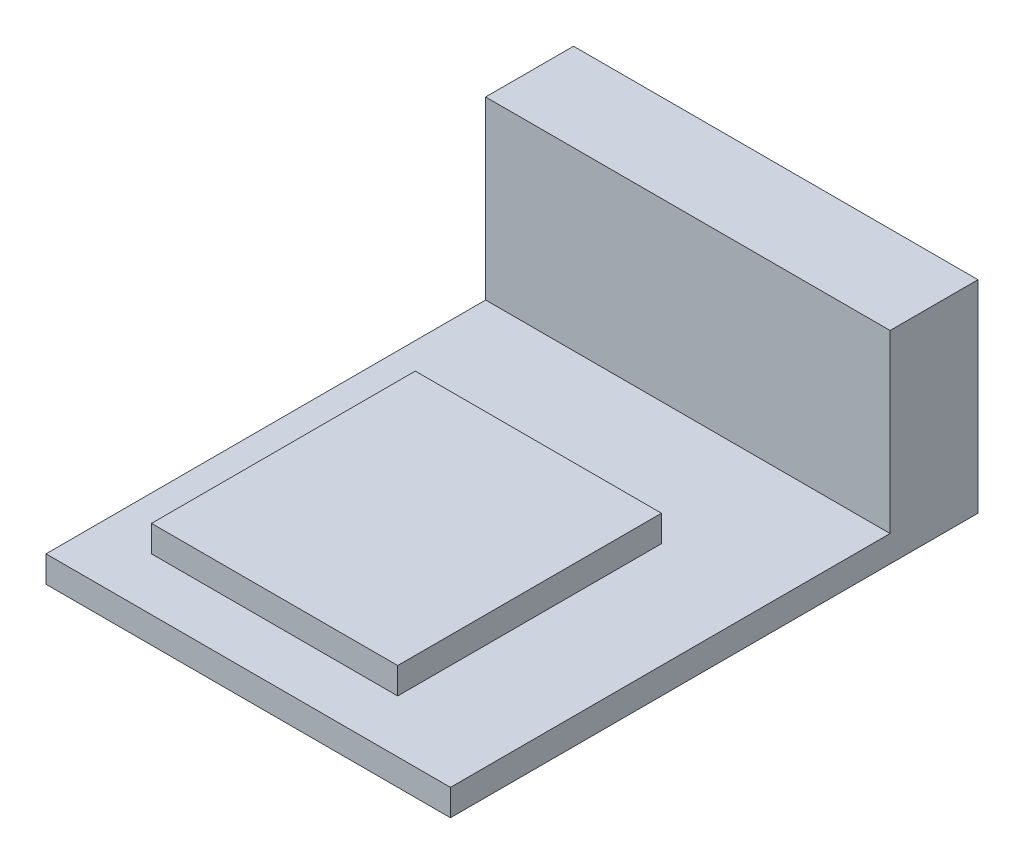
ISO-10303-21;
HEADER;
FILE_DESCRIPTION(('STEP AP214'),'2;1');
FILE_NAME('part.step','',(''),(''),'','','');
FILE_SCHEMA(('AUTOMOTIVE_DESIGN { 1 0 10303 214 1 1 1 1 }'));
ENDSEC;
DATA;
#1=APPLICATION_CONTEXT('core data for automotive mechanical design processes');
#2=APPLICATION_PROTOCOL_DEFINITION('international standard','automotive_design',2000,#1);
#3=PRODUCT_CONTEXT('',#1,'mechanical');
#4=PRODUCT('Part','Part','',(#3));
#5=PRODUCT_RELATED_PRODUCT_CATEGORY('part','',(#4));
#6=PRODUCT_DEFINITION_FORMATION('','',#4);
#7=PRODUCT_DEFINITION_CONTEXT('part definition',#1,'design');
#8=PRODUCT_DEFINITION('design','',#6,#7);
#9=PRODUCT_DEFINITION_SHAPE('','',#8);
#10=(LENGTH_UNIT() NAMED_UNIT(*) SI_UNIT(.MILLI.,.METRE.));
#11=(NAMED_UNIT(*) PLANE_ANGLE_UNIT() SI_UNIT($,.RADIAN.));
#12=(NAMED_UNIT(*) SI_UNIT($,.STERADIAN.) SOLID_ANGLE_UNIT());
#13=UNCERTAINTY_MEASURE_WITH_UNIT(LENGTH_MEASURE(1.E-05),#10,'distance_accuracy_value','');
#14=(GEOMETRIC_REPRESENTATION_CONTEXT(3) GLOBAL_UNCERTAINTY_ASSIGNED_CONTEXT((#13)) GLOBAL_UNIT_ASSIGNED_CONTEXT((#10,
#11,#12)) REPRESENTATION_CONTEXT('',''));
#15=CARTESIAN_POINT('',(0.,0.,0.));
#16=DIRECTION('',(0.,0.,1.));
#17=DIRECTION('',(1.,0.,0.));
#18=AXIS2_PLACEMENT_3D('',#15,#16,#17);
#19=CARTESIAN_POINT('',(0.,1.5,0.));
#20=DIRECTION('',(0.,1.,0.));
#21=DIRECTION('',(0.,0.,1.));
#22=AXIS2_PLACEMENT_3D('',#19,#20,#21);
#23=PLANE('',#22);
#24=DIRECTION('',(0.,0.,1.));
#25=VECTOR('',#24,1.);
#26=CARTESIAN_POINT('',(3.,1.5,12.));
#27=LINE('',#26,#25);
#28=CARTESIAN_POINT('',(3.,1.5,12.));
#29=VERTEX_POINT('',#28);
#30=CARTESIAN_POINT('',(3.,1.5,27.));
#31=VERTEX_POINT('',#30);
#32=EDGE_CURVE('E64',#29,#31,#27,.T.);
#33=ORIENTED_EDGE('',*,*,#32,.F.);
#34=DIRECTION('',(-1.,0.,0.));
#35=VECTOR('',#34,1.);
#36=CARTESIAN_POINT('',(3.,1.5,12.));
#37=LINE('',#36,#35);
#38=CARTESIAN_POINT('',(17.,1.5,12.));
#39=VERTEX_POINT('',#38);
#40=EDGE_CURVE('E153',#39,#29,#37,.T.);
#41=ORIENTED_EDGE('',*,*,#40,.F.);
#42=DIRECTION('',(0.,0.,-1.));
#43=VECTOR('',#42,1.);
#44=CARTESIAN_POINT('',(17.,1.5,12.));
#45=LINE('',#44,#43);
#46=CARTESIAN_POINT('',(17.,1.5,27.));
#47=VERTEX_POINT('',#46);
#48=EDGE_CURVE('E164',#47,#39,#45,.T.);
#49=ORIENTED_EDGE('',*,*,#48,.F.);
#50=DIRECTION('',(1.,0.,0.));
#51=VECTOR('',#50,1.);
#52=CARTESIAN_POINT('',(3.,1.5,27.));
#53=LINE('',#52,#51);
#54=EDGE_CURVE('E161',#31,#47,#53,.T.);
#55=ORIENTED_EDGE('',*,*,#54,.F.);
#56=EDGE_LOOP('',(#33,#41,#49,#55));
#57=FACE_BOUND('',#56,.T.);
#58=DIRECTION('',(0.,0.,-1.));
#59=VECTOR('',#58,1.);
#60=CARTESIAN_POINT('',(23.,1.5,0.));
#61=LINE('',#60,#59);
#62=CARTESIAN_POINT('',(23.,1.5,30.));
#63=VERTEX_POINT('',#62);
#64=CARTESIAN_POINT('',(23.,1.5,5.));
#65=VERTEX_POINT('',#64);
#66=EDGE_CURVE('E56',#63,#65,#61,.T.);
#67=ORIENTED_EDGE('',*,*,#66,.T.);
#68=DIRECTION('',(1.,0.,0.));
#69=VECTOR('',#68,1.);
#70=CARTESIAN_POINT('',(0.,1.5,5.));
#71=LINE('',#70,#69);
#72=CARTESIAN_POINT('',(0.,1.5,5.));
#73=VERTEX_POINT('',#72);
#74=EDGE_CURVE('E131',#73,#65,#71,.T.);
#75=ORIENTED_EDGE('',*,*,#74,.F.);
#76=DIRECTION('',(0.,0.,1.));
#77=VECTOR('',#76,1.);
#78=CARTESIAN_POINT('',(0.,1.5,0.));
#79=LINE('',#78,#77);
#80=CARTESIAN_POINT('',(0.,1.5,30.));
#81=VERTEX_POINT('',#80);
#82=EDGE_CURVE('E180',#73,#81,#79,.T.);
#83=ORIENTED_EDGE('',*,*,#82,.T.);
#84=DIRECTION('',(1.,0.,0.));
#85=VECTOR('',#84,1.);
#86=CARTESIAN_POINT('',(0.,1.5,30.));
#87=LINE('',#86,#85);
#88=EDGE_CURVE('E182',#81,#63,#87,.T.);
#89=ORIENTED_EDGE('',*,*,#88,.T.);
#90=EDGE_LOOP('',(#67,#75,#83,#89));
#91=FACE_BOUND('',#90,.T.);
#92=ADVANCED_FACE('F41',(#57,#91),#23,.T.);
#93=CARTESIAN_POINT('',(0.,1.5,0.));
#94=DIRECTION('',(1.,0.,0.));
#95=DIRECTION('',(0.,0.,-1.));
#96=AXIS2_PLACEMENT_3D('',#93,#94,#95);
#97=PLANE('',#96);
#98=DIRECTION('',(0.,0.,1.));
#99=VECTOR('',#98,1.);
#100=CARTESIAN_POINT('',(0.,0.,0.));
#101=LINE('',#100,#99);
#102=CARTESIAN_POINT('',(0.,0.,0.));
#103=VERTEX_POINT('',#102);
#104=CARTESIAN_POINT('',(0.,0.,30.));
#105=VERTEX_POINT('',#104);
#106=EDGE_CURVE('E179',#103,#105,#101,.T.);
#107=ORIENTED_EDGE('',*,*,#106,.T.);
#108=DIRECTION('',(0.,-1.,0.));
#109=VECTOR('',#108,1.);
#110=CARTESIAN_POINT('',(0.,1.5,30.));
#111=LINE('',#110,#109);
#112=EDGE_CURVE('E11',#81,#105,#111,.T.);
#113=ORIENTED_EDGE('',*,*,#112,.F.);
#114=ORIENTED_EDGE('',*,*,#82,.F.);
#115=DIRECTION('',(0.,-1.,0.));
#116=VECTOR('',#115,1.);
#117=CARTESIAN_POINT('',(0.,11.5,5.));
#118=LINE('',#117,#116);
#119=CARTESIAN_POINT('',(0.,11.5,5.));
#120=VERTEX_POINT('',#119);
#121=EDGE_CURVE('E137',#120,#73,#118,.T.);
#122=ORIENTED_EDGE('',*,*,#121,.F.);
#123=DIRECTION('',(0.,0.,1.));
#124=VECTOR('',#123,1.);
#125=CARTESIAN_POINT('',(0.,11.5,0.));
#126=LINE('',#125,#124);
#127=CARTESIAN_POINT('',(0.,11.5,0.));
#128=VERTEX_POINT('',#127);
#129=EDGE_CURVE('E127',#128,#120,#126,.T.);
#130=ORIENTED_EDGE('',*,*,#129,.F.);
#131=DIRECTION('',(0.,-1.,0.));
#132=VECTOR('',#131,1.);
#133=CARTESIAN_POINT('',(0.,1.5,0.));
#134=LINE('',#133,#132);
#135=EDGE_CURVE('E186',#128,#103,#134,.T.);
#136=ORIENTED_EDGE('',*,*,#135,.T.);
#137=EDGE_LOOP('',(#107,#113,#114,#122,#130,#136));
#138=FACE_BOUND('',#137,.T.);
#139=ADVANCED_FACE('F43',(#138),#97,.F.);
#140=CARTESIAN_POINT('',(0.,1.5,30.));
#141=DIRECTION('',(0.,0.,-1.));
#142=DIRECTION('',(-1.,0.,0.));
#143=AXIS2_PLACEMENT_3D('',#140,#141,#142);
#144=PLANE('',#143);
#145=DIRECTION('',(1.,0.,0.));
#146=VECTOR('',#145,1.);
#147=CARTESIAN_POINT('',(0.,0.,30.));
#148=LINE('',#147,#146);
#149=CARTESIAN_POINT('',(23.,0.,30.));
#150=VERTEX_POINT('',#149);
#151=EDGE_CURVE('E189',#105,#150,#148,.T.);
#152=ORIENTED_EDGE('',*,*,#151,.T.);
#153=DIRECTION('',(0.,-1.,0.));
#154=VECTOR('',#153,1.);
#155=CARTESIAN_POINT('',(23.,1.5,30.));
#156=LINE('',#155,#154);
#157=EDGE_CURVE('E49',#63,#150,#156,.T.);
#158=ORIENTED_EDGE('',*,*,#157,.F.);
#159=ORIENTED_EDGE('',*,*,#88,.F.);
#160=ORIENTED_EDGE('',*,*,#112,.T.);
#161=EDGE_LOOP('',(#152,#158,#159,#160));
#162=FACE_BOUND('',#161,.T.);
#163=ADVANCED_FACE('F215',(#162),#144,.F.);
#164=CARTESIAN_POINT('',(23.,1.5,0.));
#165=DIRECTION('',(-1.,0.,0.));
#166=DIRECTION('',(0.,0.,1.));
#167=AXIS2_PLACEMENT_3D('',#164,#165,#166);
#168=PLANE('',#167);
#169=DIRECTION('',(0.,0.,-1.));
#170=VECTOR('',#169,1.);
#171=CARTESIAN_POINT('',(23.,0.,0.));
#172=LINE('',#171,#170);
#173=CARTESIAN_POINT('',(23.,0.,0.));
#174=VERTEX_POINT('',#173);
#175=EDGE_CURVE('E191',#150,#174,#172,.T.);
#176=ORIENTED_EDGE('',*,*,#175,.T.);
#177=DIRECTION('',(0.,-1.,0.));
#178=VECTOR('',#177,1.);
#179=CARTESIAN_POINT('',(23.,1.5,0.));
#180=LINE('',#179,#178);
#181=CARTESIAN_POINT('',(23.,11.5,0.));
#182=VERTEX_POINT('',#181);
#183=EDGE_CURVE('E141',#182,#174,#180,.T.);
#184=ORIENTED_EDGE('',*,*,#183,.F.);
#185=DIRECTION('',(0.,0.,1.));
#186=VECTOR('',#185,1.);
#187=CARTESIAN_POINT('',(23.,11.5,0.));
#188=LINE('',#187,#186);
#189=CARTESIAN_POINT('',(23.,11.5,5.));
#190=VERTEX_POINT('',#189);
#191=EDGE_CURVE('E124',#182,#190,#188,.T.);
#192=ORIENTED_EDGE('',*,*,#191,.T.);
#193=DIRECTION('',(0.,-1.,0.));
#194=VECTOR('',#193,1.);
#195=CARTESIAN_POINT('',(23.,11.5,5.));
#196=LINE('',#195,#194);
#197=EDGE_CURVE('E134',#190,#65,#196,.T.);
#198=ORIENTED_EDGE('',*,*,#197,.T.);
#199=ORIENTED_EDGE('',*,*,#66,.F.);
#200=ORIENTED_EDGE('',*,*,#157,.T.);
#201=EDGE_LOOP('',(#176,#184,#192,#198,#199,#200));
#202=FACE_BOUND('',#201,.T.);
#203=ADVANCED_FACE('F139',(#202),#168,.F.);
#204=CARTESIAN_POINT('',(0.,1.5,0.));
#205=DIRECTION('',(0.,0.,1.));
#206=DIRECTION('',(1.,0.,0.));
#207=AXIS2_PLACEMENT_3D('',#204,#205,#206);
#208=PLANE('',#207);
#209=DIRECTION('',(-1.,0.,0.));
#210=VECTOR('',#209,1.);
#211=CARTESIAN_POINT('',(0.,0.,0.));
#212=LINE('',#211,#210);
#213=EDGE_CURVE('E183',#174,#103,#212,.T.);
#214=ORIENTED_EDGE('',*,*,#213,.T.);
#215=ORIENTED_EDGE('',*,*,#135,.F.);
#216=DIRECTION('',(1.,0.,0.));
#217=VECTOR('',#216,1.);
#218=CARTESIAN_POINT('',(0.,11.5,0.));
#219=LINE('',#218,#217);
#220=EDGE_CURVE('E142',#128,#182,#219,.T.);
#221=ORIENTED_EDGE('',*,*,#220,.T.);
#222=ORIENTED_EDGE('',*,*,#183,.T.);
#223=EDGE_LOOP('',(#214,#215,#221,#222));
#224=FACE_BOUND('',#223,.T.);
#225=ADVANCED_FACE('F206',(#224),#208,.F.);
#226=CARTESIAN_POINT('',(0.,0.,0.));
#227=DIRECTION('',(0.,1.,0.));
#228=DIRECTION('',(0.,0.,1.));
#229=AXIS2_PLACEMENT_3D('',#226,#227,#228);
#230=PLANE('',#229);
#231=ORIENTED_EDGE('',*,*,#106,.F.);
#232=ORIENTED_EDGE('',*,*,#213,.F.);
#233=ORIENTED_EDGE('',*,*,#175,.F.);
#234=ORIENTED_EDGE('',*,*,#151,.F.);
#235=EDGE_LOOP('',(#231,#232,#233,#234));
#236=FACE_BOUND('',#235,.T.);
#237=ADVANCED_FACE('F204',(#236),#230,.F.);
#238=CARTESIAN_POINT('',(3.,3.,12.));
#239=DIRECTION('',(1.,0.,0.));
#240=DIRECTION('',(0.,0.,-1.));
#241=AXIS2_PLACEMENT_3D('',#238,#239,#240);
#242=PLANE('',#241);
#243=ORIENTED_EDGE('',*,*,#32,.T.);
#244=DIRECTION('',(0.,-1.,0.));
#245=VECTOR('',#244,1.);
#246=CARTESIAN_POINT('',(3.,3.,27.));
#247=LINE('',#246,#245);
#248=CARTESIAN_POINT('',(3.,3.,27.));
#249=VERTEX_POINT('',#248);
#250=EDGE_CURVE('E176',#249,#31,#247,.T.);
#251=ORIENTED_EDGE('',*,*,#250,.F.);
#252=DIRECTION('',(0.,0.,1.));
#253=VECTOR('',#252,1.);
#254=CARTESIAN_POINT('',(3.,3.,12.));
#255=LINE('',#254,#253);
#256=CARTESIAN_POINT('',(3.,3.,12.));
#257=VERTEX_POINT('',#256);
#258=EDGE_CURVE('E149',#257,#249,#255,.T.);
#259=ORIENTED_EDGE('',*,*,#258,.F.);
#260=DIRECTION('',(0.,-1.,0.));
#261=VECTOR('',#260,1.);
#262=CARTESIAN_POINT('',(3.,3.,12.));
#263=LINE('',#262,#261);
#264=EDGE_CURVE('E159',#257,#29,#263,.T.);
#265=ORIENTED_EDGE('',*,*,#264,.T.);
#266=EDGE_LOOP('',(#243,#251,#259,#265));
#267=FACE_BOUND('',#266,.T.);
#268=ADVANCED_FACE('F218',(#267),#242,.F.);
#269=CARTESIAN_POINT('',(3.,3.,27.));
#270=DIRECTION('',(0.,0.,-1.));
#271=DIRECTION('',(-1.,0.,0.));
#272=AXIS2_PLACEMENT_3D('',#269,#270,#271);
#273=PLANE('',#272);
#274=ORIENTED_EDGE('',*,*,#54,.T.);
#275=DIRECTION('',(0.,-1.,0.));
#276=VECTOR('',#275,1.);
#277=CARTESIAN_POINT('',(17.,3.,27.));
#278=LINE('',#277,#276);
#279=CARTESIAN_POINT('',(17.,3.,27.));
#280=VERTEX_POINT('',#279);
#281=EDGE_CURVE('E173',#280,#47,#278,.T.);
#282=ORIENTED_EDGE('',*,*,#281,.F.);
#283=DIRECTION('',(1.,0.,0.));
#284=VECTOR('',#283,1.);
#285=CARTESIAN_POINT('',(3.,3.,27.));
#286=LINE('',#285,#284);
#287=EDGE_CURVE('E152',#249,#280,#286,.T.);
#288=ORIENTED_EDGE('',*,*,#287,.F.);
#289=ORIENTED_EDGE('',*,*,#250,.T.);
#290=EDGE_LOOP('',(#274,#282,#288,#289));
#291=FACE_BOUND('',#290,.T.);
#292=ADVANCED_FACE('F243',(#291),#273,.F.);
#293=CARTESIAN_POINT('',(17.,3.,12.));
#294=DIRECTION('',(-1.,0.,0.));
#295=DIRECTION('',(0.,0.,1.));
#296=AXIS2_PLACEMENT_3D('',#293,#294,#295);
#297=PLANE('',#296);
#298=ORIENTED_EDGE('',*,*,#48,.T.);
#299=DIRECTION('',(0.,-1.,0.));
#300=VECTOR('',#299,1.);
#301=CARTESIAN_POINT('',(17.,3.,12.));
#302=LINE('',#301,#300);
#303=CARTESIAN_POINT('',(17.,3.,12.));
#304=VERTEX_POINT('',#303);
#305=EDGE_CURVE('E170',#304,#39,#302,.T.);
#306=ORIENTED_EDGE('',*,*,#305,.F.);
#307=DIRECTION('',(0.,0.,-1.));
#308=VECTOR('',#307,1.);
#309=CARTESIAN_POINT('',(17.,3.,12.));
#310=LINE('',#309,#308);
#311=EDGE_CURVE('E155',#280,#304,#310,.T.);
#312=ORIENTED_EDGE('',*,*,#311,.F.);
#313=ORIENTED_EDGE('',*,*,#281,.T.);
#314=EDGE_LOOP('',(#298,#306,#312,#313));
#315=FACE_BOUND('',#314,.T.);
#316=ADVANCED_FACE('F251',(#315),#297,.F.);
#317=CARTESIAN_POINT('',(3.,3.,12.));
#318=DIRECTION('',(0.,0.,1.));
#319=DIRECTION('',(1.,0.,0.));
#320=AXIS2_PLACEMENT_3D('',#317,#318,#319);
#321=PLANE('',#320);
#322=ORIENTED_EDGE('',*,*,#40,.T.);
#323=ORIENTED_EDGE('',*,*,#264,.F.);
#324=DIRECTION('',(-1.,0.,0.));
#325=VECTOR('',#324,1.);
#326=CARTESIAN_POINT('',(3.,3.,12.));
#327=LINE('',#326,#325);
#328=EDGE_CURVE('E157',#304,#257,#327,.T.);
#329=ORIENTED_EDGE('',*,*,#328,.F.);
#330=ORIENTED_EDGE('',*,*,#305,.T.);
#331=EDGE_LOOP('',(#322,#323,#329,#330));
#332=FACE_BOUND('',#331,.T.);
#333=ADVANCED_FACE('F259',(#332),#321,.F.);
#334=CARTESIAN_POINT('',(0.,3.,0.));
#335=DIRECTION('',(0.,1.,0.));
#336=DIRECTION('',(0.,0.,1.));
#337=AXIS2_PLACEMENT_3D('',#334,#335,#336);
#338=PLANE('',#337);
#339=ORIENTED_EDGE('',*,*,#258,.T.);
#340=ORIENTED_EDGE('',*,*,#287,.T.);
#341=ORIENTED_EDGE('',*,*,#311,.T.);
#342=ORIENTED_EDGE('',*,*,#328,.T.);
#343=EDGE_LOOP('',(#339,#340,#341,#342));
#344=FACE_BOUND('',#343,.T.);
#345=ADVANCED_FACE('F267',(#344),#338,.T.);
#346=CARTESIAN_POINT('',(0.,11.5,5.));
#347=DIRECTION('',(0.,0.,-1.));
#348=DIRECTION('',(-1.,0.,0.));
#349=AXIS2_PLACEMENT_3D('',#346,#347,#348);
#350=PLANE('',#349);
#351=ORIENTED_EDGE('',*,*,#74,.T.);
#352=ORIENTED_EDGE('',*,*,#197,.F.);
#353=DIRECTION('',(1.,0.,0.));
#354=VECTOR('',#353,1.);
#355=CARTESIAN_POINT('',(0.,11.5,5.));
#356=LINE('',#355,#354);
#357=EDGE_CURVE('E119',#120,#190,#356,.T.);
#358=ORIENTED_EDGE('',*,*,#357,.F.);
#359=ORIENTED_EDGE('',*,*,#121,.T.);
#360=EDGE_LOOP('',(#351,#352,#358,#359));
#361=FACE_BOUND('',#360,.T.);
#362=ADVANCED_FACE('F135',(#361),#350,.F.);
#363=CARTESIAN_POINT('',(0.,11.5,0.));
#364=DIRECTION('',(0.,-1.,0.));
#365=DIRECTION('',(0.,0.,-1.));
#366=AXIS2_PLACEMENT_3D('',#363,#364,#365);
#367=PLANE('',#366);
#368=ORIENTED_EDGE('',*,*,#357,.T.);
#369=ORIENTED_EDGE('',*,*,#191,.F.);
#370=ORIENTED_EDGE('',*,*,#220,.F.);
#371=ORIENTED_EDGE('',*,*,#129,.T.);
#372=EDGE_LOOP('',(#368,#369,#370,#371));
#373=FACE_BOUND('',#372,.T.);
#374=ADVANCED_FACE('F121',(#373),#367,.F.);
#375=CLOSED_SHELL('',(#92,#139,#163,#203,#225,#237,#268,#292,#316,#333,#345,#362,#374));
#376=MANIFOLD_SOLID_BREP('B2',#375);
#377=ADVANCED_BREP_SHAPE_REPRESENTATION('',(#18,#376),#14);
#378=SHAPE_DEFINITION_REPRESENTATION(#9,#377);
ENDSEC;
END-ISO-10303-21;
